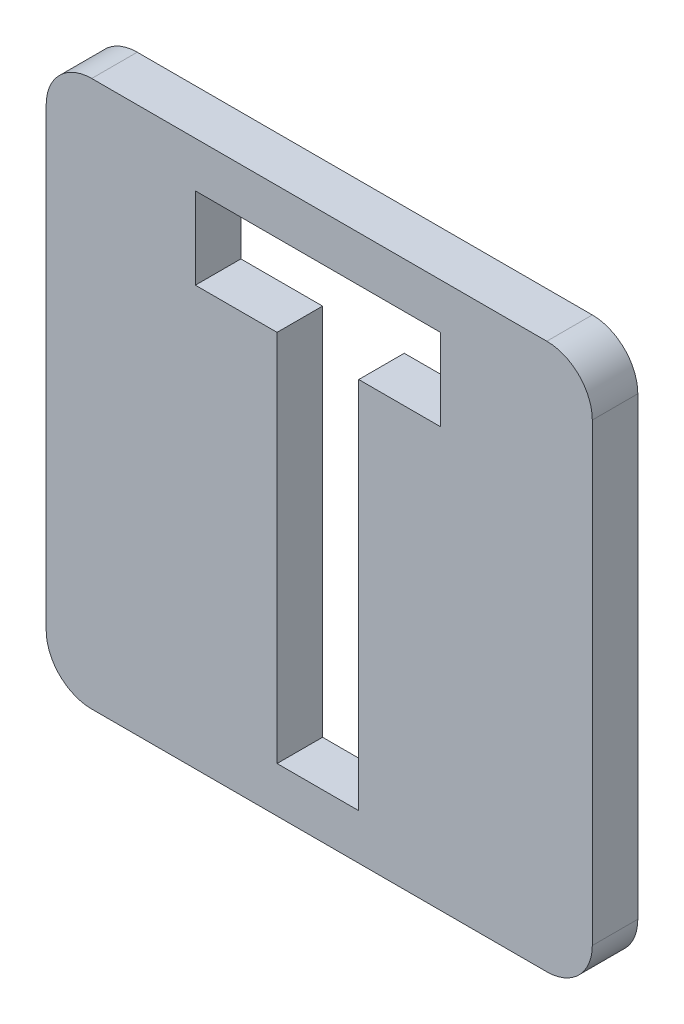
ISO-10303-21;
HEADER;
FILE_DESCRIPTION(('STEP AP214'),'2;1');
FILE_NAME('part.step','',(''),(''),'','','');
FILE_SCHEMA(('AUTOMOTIVE_DESIGN { 1 0 10303 214 1 1 1 1 }'));
ENDSEC;
DATA;
#1=APPLICATION_CONTEXT('core data for automotive mechanical design processes');
#2=APPLICATION_PROTOCOL_DEFINITION('international standard','automotive_design',2000,#1);
#3=PRODUCT_CONTEXT('',#1,'mechanical');
#4=PRODUCT('Part','Part','',(#3));
#5=PRODUCT_RELATED_PRODUCT_CATEGORY('part','',(#4));
#6=PRODUCT_DEFINITION_FORMATION('','',#4);
#7=PRODUCT_DEFINITION_CONTEXT('part definition',#1,'design');
#8=PRODUCT_DEFINITION('design','',#6,#7);
#9=PRODUCT_DEFINITION_SHAPE('','',#8);
#10=(LENGTH_UNIT() NAMED_UNIT(*) SI_UNIT(.MILLI.,.METRE.));
#11=(NAMED_UNIT(*) PLANE_ANGLE_UNIT() SI_UNIT($,.RADIAN.));
#12=(NAMED_UNIT(*) SI_UNIT($,.STERADIAN.) SOLID_ANGLE_UNIT());
#13=UNCERTAINTY_MEASURE_WITH_UNIT(LENGTH_MEASURE(1.E-05),#10,'distance_accuracy_value','');
#14=(GEOMETRIC_REPRESENTATION_CONTEXT(3) GLOBAL_UNCERTAINTY_ASSIGNED_CONTEXT((#13)) GLOBAL_UNIT_ASSIGNED_CONTEXT((#10,
#11,#12)) REPRESENTATION_CONTEXT('',''));
#15=CARTESIAN_POINT('',(0.,0.,0.));
#16=DIRECTION('',(0.,0.,1.));
#17=DIRECTION('',(1.,0.,0.));
#18=AXIS2_PLACEMENT_3D('',#15,#16,#17);
#19=CARTESIAN_POINT('',(50.,50.,10.));
#20=DIRECTION('',(0.,0.,-1.));
#21=DIRECTION('',(-1.,0.,0.));
#22=AXIS2_PLACEMENT_3D('',#19,#20,#21);
#23=PLANE('',#22);
#24=DIRECTION('',(1.,0.,0.));
#25=VECTOR('',#24,1.);
#26=CARTESIAN_POINT('',(-49.9999999999999,60.,10.));
#27=LINE('',#26,#25);
#28=CARTESIAN_POINT('',(-49.9999999999999,60.,10.));
#29=VERTEX_POINT('',#28);
#30=CARTESIAN_POINT('',(49.9999999999999,60.,10.));
#31=VERTEX_POINT('',#30);
#32=EDGE_CURVE('E213',#29,#31,#27,.T.);
#33=ORIENTED_EDGE('',*,*,#32,.F.);
#34=CARTESIAN_POINT('',(-50.,50.,10.));
#35=DIRECTION('',(0.,0.,1.));
#36=DIRECTION('',(1.,0.,0.));
#37=AXIS2_PLACEMENT_3D('',#34,#35,#36);
#38=CIRCLE('',#37,10.);
#39=CARTESIAN_POINT('',(-60.,49.9999999999999,10.));
#40=VERTEX_POINT('',#39);
#41=EDGE_CURVE('E231',#29,#40,#38,.T.);
#42=ORIENTED_EDGE('',*,*,#41,.T.);
#43=DIRECTION('',(0.,-1.,0.));
#44=VECTOR('',#43,1.);
#45=CARTESIAN_POINT('',(-60.,49.9999999999999,10.));
#46=LINE('',#45,#44);
#47=CARTESIAN_POINT('',(-60.,-49.9999999999999,10.));
#48=VERTEX_POINT('',#47);
#49=EDGE_CURVE('E229',#40,#48,#46,.T.);
#50=ORIENTED_EDGE('',*,*,#49,.T.);
#51=CARTESIAN_POINT('',(-50.,-50.,10.));
#52=DIRECTION('',(0.,0.,1.));
#53=DIRECTION('',(1.,0.,0.));
#54=AXIS2_PLACEMENT_3D('',#51,#52,#53);
#55=CIRCLE('',#54,10.);
#56=CARTESIAN_POINT('',(-49.9999999999999,-60.,10.));
#57=VERTEX_POINT('',#56);
#58=EDGE_CURVE('E227',#48,#57,#55,.T.);
#59=ORIENTED_EDGE('',*,*,#58,.T.);
#60=DIRECTION('',(1.,0.,0.));
#61=VECTOR('',#60,1.);
#62=CARTESIAN_POINT('',(-49.9999999999999,-60.,10.));
#63=LINE('',#62,#61);
#64=CARTESIAN_POINT('',(49.9999999999999,-60.,10.));
#65=VERTEX_POINT('',#64);
#66=EDGE_CURVE('E225',#57,#65,#63,.T.);
#67=ORIENTED_EDGE('',*,*,#66,.T.);
#68=CARTESIAN_POINT('',(50.,-50.,10.));
#69=DIRECTION('',(0.,0.,1.));
#70=DIRECTION('',(1.,0.,0.));
#71=AXIS2_PLACEMENT_3D('',#68,#69,#70);
#72=CIRCLE('',#71,10.);
#73=CARTESIAN_POINT('',(60.,-50.,10.));
#74=VERTEX_POINT('',#73);
#75=EDGE_CURVE('E223',#65,#74,#72,.T.);
#76=ORIENTED_EDGE('',*,*,#75,.T.);
#77=DIRECTION('',(0.,-1.,0.));
#78=VECTOR('',#77,1.);
#79=CARTESIAN_POINT('',(60.,49.9999999999999,10.));
#80=LINE('',#79,#78);
#81=CARTESIAN_POINT('',(60.,49.9999999999999,10.));
#82=VERTEX_POINT('',#81);
#83=EDGE_CURVE('E220',#82,#74,#80,.T.);
#84=ORIENTED_EDGE('',*,*,#83,.F.);
#85=CARTESIAN_POINT('',(50.,50.,10.));
#86=DIRECTION('',(0.,0.,-1.));
#87=DIRECTION('',(-1.,0.,0.));
#88=AXIS2_PLACEMENT_3D('',#85,#86,#87);
#89=CIRCLE('',#88,10.);
#90=EDGE_CURVE('E216',#31,#82,#89,.T.);
#91=ORIENTED_EDGE('',*,*,#90,.F.);
#92=EDGE_LOOP('',(#33,#42,#50,#59,#67,#76,#84,#91));
#93=FACE_BOUND('',#92,.T.);
#94=DIRECTION('',(0.,1.,0.));
#95=VECTOR('',#94,1.);
#96=CARTESIAN_POINT('',(-27.2179487179487,32.0512820512821,10.));
#97=LINE('',#96,#95);
#98=CARTESIAN_POINT('',(-27.2179487179487,32.0512820512821,10.));
#99=VERTEX_POINT('',#98);
#100=CARTESIAN_POINT('',(-27.2179487179487,50.,10.));
#101=VERTEX_POINT('',#100);
#102=EDGE_CURVE('E50',#99,#101,#97,.T.);
#103=ORIENTED_EDGE('',*,*,#102,.T.);
#104=DIRECTION('',(1.,0.,0.));
#105=VECTOR('',#104,1.);
#106=CARTESIAN_POINT('',(-27.2179487179487,50.,10.));
#107=LINE('',#106,#105);
#108=CARTESIAN_POINT('',(26.6282051282051,50.,10.));
#109=VERTEX_POINT('',#108);
#110=EDGE_CURVE('E162',#101,#109,#107,.T.);
#111=ORIENTED_EDGE('',*,*,#110,.T.);
#112=DIRECTION('',(0.,-1.,0.));
#113=VECTOR('',#112,1.);
#114=CARTESIAN_POINT('',(26.6282051282051,50.,10.));
#115=LINE('',#114,#113);
#116=CARTESIAN_POINT('',(26.6282051282051,32.0512820512821,10.));
#117=VERTEX_POINT('',#116);
#118=EDGE_CURVE('E185',#109,#117,#115,.T.);
#119=ORIENTED_EDGE('',*,*,#118,.T.);
#120=DIRECTION('',(-1.,0.,0.));
#121=VECTOR('',#120,1.);
#122=CARTESIAN_POINT('',(26.6282051282051,32.0512820512821,10.));
#123=LINE('',#122,#121);
#124=CARTESIAN_POINT('',(8.67948717948718,32.0512820512821,10.));
#125=VERTEX_POINT('',#124);
#126=EDGE_CURVE('E188',#117,#125,#123,.T.);
#127=ORIENTED_EDGE('',*,*,#126,.T.);
#128=DIRECTION('',(0.,-1.,0.));
#129=VECTOR('',#128,1.);
#130=CARTESIAN_POINT('',(8.67948717948718,32.0512820512821,10.));
#131=LINE('',#130,#129);
#132=CARTESIAN_POINT('',(8.67948717948718,-50.,10.));
#133=VERTEX_POINT('',#132);
#134=EDGE_CURVE('E191',#125,#133,#131,.T.);
#135=ORIENTED_EDGE('',*,*,#134,.T.);
#136=DIRECTION('',(-1.,0.,0.));
#137=VECTOR('',#136,1.);
#138=CARTESIAN_POINT('',(8.67948717948718,-50.,10.));
#139=LINE('',#138,#137);
#140=CARTESIAN_POINT('',(-9.26923076923077,-50.,10.));
#141=VERTEX_POINT('',#140);
#142=EDGE_CURVE('E194',#133,#141,#139,.T.);
#143=ORIENTED_EDGE('',*,*,#142,.T.);
#144=DIRECTION('',(0.,1.,0.));
#145=VECTOR('',#144,1.);
#146=CARTESIAN_POINT('',(-9.26923076923077,-50.,10.));
#147=LINE('',#146,#145);
#148=CARTESIAN_POINT('',(-9.26923076923077,32.0512820512821,10.));
#149=VERTEX_POINT('',#148);
#150=EDGE_CURVE('E197',#141,#149,#147,.T.);
#151=ORIENTED_EDGE('',*,*,#150,.T.);
#152=DIRECTION('',(-1.,0.,0.));
#153=VECTOR('',#152,1.);
#154=CARTESIAN_POINT('',(-9.26923076923077,32.0512820512821,10.));
#155=LINE('',#154,#153);
#156=EDGE_CURVE('E156',#149,#99,#155,.T.);
#157=ORIENTED_EDGE('',*,*,#156,.T.);
#158=EDGE_LOOP('',(#103,#111,#119,#127,#135,#143,#151,#157));
#159=FACE_BOUND('',#158,.T.);
#160=ADVANCED_FACE('F33',(#93,#159),#23,.F.);
#161=CARTESIAN_POINT('',(50.,50.,0.));
#162=DIRECTION('',(0.,0.,-1.));
#163=DIRECTION('',(-1.,0.,0.));
#164=AXIS2_PLACEMENT_3D('',#161,#162,#163);
#165=PLANE('',#164);
#166=DIRECTION('',(1.,0.,0.));
#167=VECTOR('',#166,1.);
#168=CARTESIAN_POINT('',(-49.9999999999999,60.,0.));
#169=LINE('',#168,#167);
#170=CARTESIAN_POINT('',(-49.9999999999999,60.,0.));
#171=VERTEX_POINT('',#170);
#172=CARTESIAN_POINT('',(49.9999999999999,60.,0.));
#173=VERTEX_POINT('',#172);
#174=EDGE_CURVE('E163',#171,#173,#169,.T.);
#175=ORIENTED_EDGE('',*,*,#174,.T.);
#176=CARTESIAN_POINT('',(50.,50.,0.));
#177=DIRECTION('',(0.,0.,-1.));
#178=DIRECTION('',(-1.,0.,0.));
#179=AXIS2_PLACEMENT_3D('',#176,#177,#178);
#180=CIRCLE('',#179,10.);
#181=CARTESIAN_POINT('',(60.,49.9999999999999,0.));
#182=VERTEX_POINT('',#181);
#183=EDGE_CURVE('E235',#173,#182,#180,.T.);
#184=ORIENTED_EDGE('',*,*,#183,.T.);
#185=DIRECTION('',(0.,-1.,0.));
#186=VECTOR('',#185,1.);
#187=CARTESIAN_POINT('',(60.,49.9999999999999,0.));
#188=LINE('',#187,#186);
#189=CARTESIAN_POINT('',(60.,-50.,0.));
#190=VERTEX_POINT('',#189);
#191=EDGE_CURVE('E238',#182,#190,#188,.T.);
#192=ORIENTED_EDGE('',*,*,#191,.T.);
#193=CARTESIAN_POINT('',(50.,-50.,0.));
#194=DIRECTION('',(0.,0.,1.));
#195=DIRECTION('',(1.,0.,0.));
#196=AXIS2_PLACEMENT_3D('',#193,#194,#195);
#197=CIRCLE('',#196,10.);
#198=CARTESIAN_POINT('',(49.9999999999999,-60.,0.));
#199=VERTEX_POINT('',#198);
#200=EDGE_CURVE('E241',#199,#190,#197,.T.);
#201=ORIENTED_EDGE('',*,*,#200,.F.);
#202=DIRECTION('',(1.,0.,0.));
#203=VECTOR('',#202,1.);
#204=CARTESIAN_POINT('',(-49.9999999999999,-60.,0.));
#205=LINE('',#204,#203);
#206=CARTESIAN_POINT('',(-49.9999999999999,-60.,0.));
#207=VERTEX_POINT('',#206);
#208=EDGE_CURVE('E244',#207,#199,#205,.T.);
#209=ORIENTED_EDGE('',*,*,#208,.F.);
#210=CARTESIAN_POINT('',(-50.,-50.,0.));
#211=DIRECTION('',(0.,0.,1.));
#212=DIRECTION('',(1.,0.,0.));
#213=AXIS2_PLACEMENT_3D('',#210,#211,#212);
#214=CIRCLE('',#213,10.);
#215=CARTESIAN_POINT('',(-60.,-49.9999999999999,0.));
#216=VERTEX_POINT('',#215);
#217=EDGE_CURVE('E246',#216,#207,#214,.T.);
#218=ORIENTED_EDGE('',*,*,#217,.F.);
#219=DIRECTION('',(0.,-1.,0.));
#220=VECTOR('',#219,1.);
#221=CARTESIAN_POINT('',(-60.,49.9999999999999,0.));
#222=LINE('',#221,#220);
#223=CARTESIAN_POINT('',(-60.,49.9999999999999,0.));
#224=VERTEX_POINT('',#223);
#225=EDGE_CURVE('E248',#224,#216,#222,.T.);
#226=ORIENTED_EDGE('',*,*,#225,.F.);
#227=CARTESIAN_POINT('',(-50.,50.,0.));
#228=DIRECTION('',(0.,0.,1.));
#229=DIRECTION('',(1.,0.,0.));
#230=AXIS2_PLACEMENT_3D('',#227,#228,#229);
#231=CIRCLE('',#230,10.);
#232=EDGE_CURVE('E217',#171,#224,#231,.T.);
#233=ORIENTED_EDGE('',*,*,#232,.F.);
#234=EDGE_LOOP('',(#175,#184,#192,#201,#209,#218,#226,#233));
#235=FACE_BOUND('',#234,.T.);
#236=DIRECTION('',(1.,0.,0.));
#237=VECTOR('',#236,1.);
#238=CARTESIAN_POINT('',(-27.2179487179487,50.,0.));
#239=LINE('',#238,#237);
#240=CARTESIAN_POINT('',(-27.2179487179487,50.,0.));
#241=VERTEX_POINT('',#240);
#242=CARTESIAN_POINT('',(26.6282051282051,50.,0.));
#243=VERTEX_POINT('',#242);
#244=EDGE_CURVE('E155',#241,#243,#239,.T.);
#245=ORIENTED_EDGE('',*,*,#244,.F.);
#246=DIRECTION('',(0.,1.,0.));
#247=VECTOR('',#246,1.);
#248=CARTESIAN_POINT('',(-27.2179487179487,32.0512820512821,0.));
#249=LINE('',#248,#247);
#250=CARTESIAN_POINT('',(-27.2179487179487,32.0512820512821,0.));
#251=VERTEX_POINT('',#250);
#252=EDGE_CURVE('E147',#251,#241,#249,.T.);
#253=ORIENTED_EDGE('',*,*,#252,.F.);
#254=DIRECTION('',(-1.,0.,0.));
#255=VECTOR('',#254,1.);
#256=CARTESIAN_POINT('',(-9.26923076923077,32.0512820512821,0.));
#257=LINE('',#256,#255);
#258=CARTESIAN_POINT('',(-9.26923076923077,32.0512820512821,0.));
#259=VERTEX_POINT('',#258);
#260=EDGE_CURVE('E181',#259,#251,#257,.T.);
#261=ORIENTED_EDGE('',*,*,#260,.F.);
#262=DIRECTION('',(0.,1.,0.));
#263=VECTOR('',#262,1.);
#264=CARTESIAN_POINT('',(-9.26923076923077,-50.,0.));
#265=LINE('',#264,#263);
#266=CARTESIAN_POINT('',(-9.26923076923077,-50.,0.));
#267=VERTEX_POINT('',#266);
#268=EDGE_CURVE('E179',#267,#259,#265,.T.);
#269=ORIENTED_EDGE('',*,*,#268,.F.);
#270=DIRECTION('',(-1.,0.,0.));
#271=VECTOR('',#270,1.);
#272=CARTESIAN_POINT('',(8.67948717948718,-50.,0.));
#273=LINE('',#272,#271);
#274=CARTESIAN_POINT('',(8.67948717948718,-50.,0.));
#275=VERTEX_POINT('',#274);
#276=EDGE_CURVE('E177',#275,#267,#273,.T.);
#277=ORIENTED_EDGE('',*,*,#276,.F.);
#278=DIRECTION('',(0.,-1.,0.));
#279=VECTOR('',#278,1.);
#280=CARTESIAN_POINT('',(8.67948717948718,32.0512820512821,0.));
#281=LINE('',#280,#279);
#282=CARTESIAN_POINT('',(8.67948717948718,32.0512820512821,0.));
#283=VERTEX_POINT('',#282);
#284=EDGE_CURVE('E175',#283,#275,#281,.T.);
#285=ORIENTED_EDGE('',*,*,#284,.F.);
#286=DIRECTION('',(-1.,0.,0.));
#287=VECTOR('',#286,1.);
#288=CARTESIAN_POINT('',(26.6282051282051,32.0512820512821,0.));
#289=LINE('',#288,#287);
#290=CARTESIAN_POINT('',(26.6282051282051,32.0512820512821,0.));
#291=VERTEX_POINT('',#290);
#292=EDGE_CURVE('E171',#291,#283,#289,.T.);
#293=ORIENTED_EDGE('',*,*,#292,.F.);
#294=DIRECTION('',(0.,-1.,0.));
#295=VECTOR('',#294,1.);
#296=CARTESIAN_POINT('',(26.6282051282051,50.,0.));
#297=LINE('',#296,#295);
#298=EDGE_CURVE('E169',#243,#291,#297,.T.);
#299=ORIENTED_EDGE('',*,*,#298,.F.);
#300=EDGE_LOOP('',(#245,#253,#261,#269,#277,#285,#293,#299));
#301=FACE_BOUND('',#300,.T.);
#302=ADVANCED_FACE('F167',(#235,#301),#165,.T.);
#303=CARTESIAN_POINT('',(-49.9999999999999,60.,10.));
#304=DIRECTION('',(0.,1.,0.));
#305=DIRECTION('',(0.,0.,1.));
#306=AXIS2_PLACEMENT_3D('',#303,#304,#305);
#307=PLANE('',#306);
#308=ORIENTED_EDGE('',*,*,#174,.F.);
#309=DIRECTION('',(0.,0.,-1.));
#310=VECTOR('',#309,1.);
#311=CARTESIAN_POINT('',(-49.9999999999999,60.,10.));
#312=LINE('',#311,#310);
#313=EDGE_CURVE('E11',#29,#171,#312,.T.);
#314=ORIENTED_EDGE('',*,*,#313,.F.);
#315=ORIENTED_EDGE('',*,*,#32,.T.);
#316=DIRECTION('',(0.,0.,-1.));
#317=VECTOR('',#316,1.);
#318=CARTESIAN_POINT('',(49.9999999999999,60.,10.));
#319=LINE('',#318,#317);
#320=EDGE_CURVE('E37',#31,#173,#319,.T.);
#321=ORIENTED_EDGE('',*,*,#320,.T.);
#322=EDGE_LOOP('',(#308,#314,#315,#321));
#323=FACE_BOUND('',#322,.T.);
#324=ADVANCED_FACE('F35',(#323),#307,.T.);
#325=CARTESIAN_POINT('',(-50.,50.,10.));
#326=DIRECTION('',(0.,0.,-1.));
#327=DIRECTION('',(-1.,0.,0.));
#328=AXIS2_PLACEMENT_3D('',#325,#326,#327);
#329=CYLINDRICAL_SURFACE('',#328,10.);
#330=ORIENTED_EDGE('',*,*,#232,.T.);
#331=DIRECTION('',(0.,0.,-1.));
#332=VECTOR('',#331,1.);
#333=CARTESIAN_POINT('',(-60.,49.9999999999999,10.));
#334=LINE('',#333,#332);
#335=EDGE_CURVE('E42',#40,#224,#334,.T.);
#336=ORIENTED_EDGE('',*,*,#335,.F.);
#337=ORIENTED_EDGE('',*,*,#41,.F.);
#338=ORIENTED_EDGE('',*,*,#313,.T.);
#339=EDGE_LOOP('',(#330,#336,#337,#338));
#340=FACE_BOUND('',#339,.T.);
#341=ADVANCED_FACE('F278',(#340),#329,.T.);
#342=CARTESIAN_POINT('',(-60.,49.9999999999999,10.));
#343=DIRECTION('',(1.,0.,0.));
#344=DIRECTION('',(0.,1.,0.));
#345=AXIS2_PLACEMENT_3D('',#342,#343,#344);
#346=PLANE('',#345);
#347=ORIENTED_EDGE('',*,*,#225,.T.);
#348=DIRECTION('',(0.,0.,-1.));
#349=VECTOR('',#348,1.);
#350=CARTESIAN_POINT('',(-60.,-49.9999999999999,10.));
#351=LINE('',#350,#349);
#352=EDGE_CURVE('E253',#48,#216,#351,.T.);
#353=ORIENTED_EDGE('',*,*,#352,.F.);
#354=ORIENTED_EDGE('',*,*,#49,.F.);
#355=ORIENTED_EDGE('',*,*,#335,.T.);
#356=EDGE_LOOP('',(#347,#353,#354,#355));
#357=FACE_BOUND('',#356,.T.);
#358=ADVANCED_FACE('F282',(#357),#346,.F.);
#359=CARTESIAN_POINT('',(-50.,-50.,10.));
#360=DIRECTION('',(0.,0.,-1.));
#361=DIRECTION('',(-1.,0.,0.));
#362=AXIS2_PLACEMENT_3D('',#359,#360,#361);
#363=CYLINDRICAL_SURFACE('',#362,10.);
#364=ORIENTED_EDGE('',*,*,#217,.T.);
#365=DIRECTION('',(0.,0.,-1.));
#366=VECTOR('',#365,1.);
#367=CARTESIAN_POINT('',(-49.9999999999999,-60.,10.));
#368=LINE('',#367,#366);
#369=EDGE_CURVE('E256',#57,#207,#368,.T.);
#370=ORIENTED_EDGE('',*,*,#369,.F.);
#371=ORIENTED_EDGE('',*,*,#58,.F.);
#372=ORIENTED_EDGE('',*,*,#352,.T.);
#373=EDGE_LOOP('',(#364,#370,#371,#372));
#374=FACE_BOUND('',#373,.T.);
#375=ADVANCED_FACE('F302',(#374),#363,.T.);
#376=CARTESIAN_POINT('',(-49.9999999999999,-60.,10.));
#377=DIRECTION('',(0.,1.,0.));
#378=DIRECTION('',(0.,0.,1.));
#379=AXIS2_PLACEMENT_3D('',#376,#377,#378);
#380=PLANE('',#379);
#381=ORIENTED_EDGE('',*,*,#208,.T.);
#382=DIRECTION('',(0.,0.,-1.));
#383=VECTOR('',#382,1.);
#384=CARTESIAN_POINT('',(49.9999999999999,-60.,10.));
#385=LINE('',#384,#383);
#386=EDGE_CURVE('E259',#65,#199,#385,.T.);
#387=ORIENTED_EDGE('',*,*,#386,.F.);
#388=ORIENTED_EDGE('',*,*,#66,.F.);
#389=ORIENTED_EDGE('',*,*,#369,.T.);
#390=EDGE_LOOP('',(#381,#387,#388,#389));
#391=FACE_BOUND('',#390,.T.);
#392=ADVANCED_FACE('F300',(#391),#380,.F.);
#393=CARTESIAN_POINT('',(50.,-50.,10.));
#394=DIRECTION('',(0.,0.,-1.));
#395=DIRECTION('',(-1.,0.,0.));
#396=AXIS2_PLACEMENT_3D('',#393,#394,#395);
#397=CYLINDRICAL_SURFACE('',#396,10.);
#398=ORIENTED_EDGE('',*,*,#200,.T.);
#399=DIRECTION('',(0.,0.,-1.));
#400=VECTOR('',#399,1.);
#401=CARTESIAN_POINT('',(60.,-50.,10.));
#402=LINE('',#401,#400);
#403=EDGE_CURVE('E262',#74,#190,#402,.T.);
#404=ORIENTED_EDGE('',*,*,#403,.F.);
#405=ORIENTED_EDGE('',*,*,#75,.F.);
#406=ORIENTED_EDGE('',*,*,#386,.T.);
#407=EDGE_LOOP('',(#398,#404,#405,#406));
#408=FACE_BOUND('',#407,.T.);
#409=ADVANCED_FACE('F296',(#408),#397,.T.);
#410=CARTESIAN_POINT('',(60.,49.9999999999999,10.));
#411=DIRECTION('',(1.,0.,0.));
#412=DIRECTION('',(0.,1.,0.));
#413=AXIS2_PLACEMENT_3D('',#410,#411,#412);
#414=PLANE('',#413);
#415=ORIENTED_EDGE('',*,*,#191,.F.);
#416=DIRECTION('',(0.,0.,-1.));
#417=VECTOR('',#416,1.);
#418=CARTESIAN_POINT('',(60.,49.9999999999999,10.));
#419=LINE('',#418,#417);
#420=EDGE_CURVE('E263',#82,#182,#419,.T.);
#421=ORIENTED_EDGE('',*,*,#420,.F.);
#422=ORIENTED_EDGE('',*,*,#83,.T.);
#423=ORIENTED_EDGE('',*,*,#403,.T.);
#424=EDGE_LOOP('',(#415,#421,#422,#423));
#425=FACE_BOUND('',#424,.T.);
#426=ADVANCED_FACE('F292',(#425),#414,.T.);
#427=CARTESIAN_POINT('',(50.,50.,10.));
#428=DIRECTION('',(0.,0.,-1.));
#429=DIRECTION('',(-1.,0.,0.));
#430=AXIS2_PLACEMENT_3D('',#427,#428,#429);
#431=CYLINDRICAL_SURFACE('',#430,10.);
#432=ORIENTED_EDGE('',*,*,#183,.F.);
#433=ORIENTED_EDGE('',*,*,#320,.F.);
#434=ORIENTED_EDGE('',*,*,#90,.T.);
#435=ORIENTED_EDGE('',*,*,#420,.T.);
#436=EDGE_LOOP('',(#432,#433,#434,#435));
#437=FACE_BOUND('',#436,.T.);
#438=ADVANCED_FACE('F271',(#437),#431,.T.);
#439=CARTESIAN_POINT('',(-27.2179487179487,32.0512820512821,0.));
#440=DIRECTION('',(1.,0.,0.));
#441=DIRECTION('',(0.,0.,-1.));
#442=AXIS2_PLACEMENT_3D('',#439,#440,#441);
#443=PLANE('',#442);
#444=ORIENTED_EDGE('',*,*,#102,.F.);
#445=DIRECTION('',(0.,0.,1.));
#446=VECTOR('',#445,1.);
#447=CARTESIAN_POINT('',(-27.2179487179487,32.0512820512821,0.));
#448=LINE('',#447,#446);
#449=EDGE_CURVE('E151',#251,#99,#448,.T.);
#450=ORIENTED_EDGE('',*,*,#449,.F.);
#451=ORIENTED_EDGE('',*,*,#252,.T.);
#452=DIRECTION('',(0.,0.,1.));
#453=VECTOR('',#452,1.);
#454=CARTESIAN_POINT('',(-27.2179487179487,50.,0.));
#455=LINE('',#454,#453);
#456=EDGE_CURVE('E150',#241,#101,#455,.T.);
#457=ORIENTED_EDGE('',*,*,#456,.T.);
#458=EDGE_LOOP('',(#444,#450,#451,#457));
#459=FACE_BOUND('',#458,.T.);
#460=ADVANCED_FACE('F149',(#459),#443,.T.);
#461=CARTESIAN_POINT('',(-27.2179487179487,50.,0.));
#462=DIRECTION('',(0.,-1.,0.));
#463=DIRECTION('',(0.,0.,-1.));
#464=AXIS2_PLACEMENT_3D('',#461,#462,#463);
#465=PLANE('',#464);
#466=ORIENTED_EDGE('',*,*,#110,.F.);
#467=ORIENTED_EDGE('',*,*,#456,.F.);
#468=ORIENTED_EDGE('',*,*,#244,.T.);
#469=DIRECTION('',(0.,0.,1.));
#470=VECTOR('',#469,1.);
#471=CARTESIAN_POINT('',(26.6282051282051,50.,0.));
#472=LINE('',#471,#470);
#473=EDGE_CURVE('E164',#243,#109,#472,.T.);
#474=ORIENTED_EDGE('',*,*,#473,.T.);
#475=EDGE_LOOP('',(#466,#467,#468,#474));
#476=FACE_BOUND('',#475,.T.);
#477=ADVANCED_FACE('F159',(#476),#465,.T.);
#478=CARTESIAN_POINT('',(26.6282051282051,50.,0.));
#479=DIRECTION('',(-1.,0.,0.));
#480=DIRECTION('',(0.,0.,1.));
#481=AXIS2_PLACEMENT_3D('',#478,#479,#480);
#482=PLANE('',#481);
#483=ORIENTED_EDGE('',*,*,#118,.F.);
#484=ORIENTED_EDGE('',*,*,#473,.F.);
#485=ORIENTED_EDGE('',*,*,#298,.T.);
#486=DIRECTION('',(0.,0.,1.));
#487=VECTOR('',#486,1.);
#488=CARTESIAN_POINT('',(26.6282051282051,32.0512820512821,0.));
#489=LINE('',#488,#487);
#490=EDGE_CURVE('E210',#291,#117,#489,.T.);
#491=ORIENTED_EDGE('',*,*,#490,.T.);
#492=EDGE_LOOP('',(#483,#484,#485,#491));
#493=FACE_BOUND('',#492,.T.);
#494=ADVANCED_FACE('F351',(#493),#482,.T.);
#495=CARTESIAN_POINT('',(26.6282051282051,32.0512820512821,0.));
#496=DIRECTION('',(0.,1.,0.));
#497=DIRECTION('',(0.,0.,1.));
#498=AXIS2_PLACEMENT_3D('',#495,#496,#497);
#499=PLANE('',#498);
#500=ORIENTED_EDGE('',*,*,#126,.F.);
#501=ORIENTED_EDGE('',*,*,#490,.F.);
#502=ORIENTED_EDGE('',*,*,#292,.T.);
#503=DIRECTION('',(0.,0.,1.));
#504=VECTOR('',#503,1.);
#505=CARTESIAN_POINT('',(8.67948717948718,32.0512820512821,0.));
#506=LINE('',#505,#504);
#507=EDGE_CURVE('E208',#283,#125,#506,.T.);
#508=ORIENTED_EDGE('',*,*,#507,.T.);
#509=EDGE_LOOP('',(#500,#501,#502,#508));
#510=FACE_BOUND('',#509,.T.);
#511=ADVANCED_FACE('F359',(#510),#499,.T.);
#512=CARTESIAN_POINT('',(8.67948717948718,32.0512820512821,0.));
#513=DIRECTION('',(-1.,0.,0.));
#514=DIRECTION('',(0.,0.,1.));
#515=AXIS2_PLACEMENT_3D('',#512,#513,#514);
#516=PLANE('',#515);
#517=ORIENTED_EDGE('',*,*,#134,.F.);
#518=ORIENTED_EDGE('',*,*,#507,.F.);
#519=ORIENTED_EDGE('',*,*,#284,.T.);
#520=DIRECTION('',(0.,0.,1.));
#521=VECTOR('',#520,1.);
#522=CARTESIAN_POINT('',(8.67948717948718,-50.,0.));
#523=LINE('',#522,#521);
#524=EDGE_CURVE('E206',#275,#133,#523,.T.);
#525=ORIENTED_EDGE('',*,*,#524,.T.);
#526=EDGE_LOOP('',(#517,#518,#519,#525));
#527=FACE_BOUND('',#526,.T.);
#528=ADVANCED_FACE('F369',(#527),#516,.T.);
#529=CARTESIAN_POINT('',(8.67948717948718,-50.,0.));
#530=DIRECTION('',(0.,1.,0.));
#531=DIRECTION('',(0.,0.,1.));
#532=AXIS2_PLACEMENT_3D('',#529,#530,#531);
#533=PLANE('',#532);
#534=ORIENTED_EDGE('',*,*,#142,.F.);
#535=ORIENTED_EDGE('',*,*,#524,.F.);
#536=ORIENTED_EDGE('',*,*,#276,.T.);
#537=DIRECTION('',(0.,0.,1.));
#538=VECTOR('',#537,1.);
#539=CARTESIAN_POINT('',(-9.26923076923077,-50.,0.));
#540=LINE('',#539,#538);
#541=EDGE_CURVE('E204',#267,#141,#540,.T.);
#542=ORIENTED_EDGE('',*,*,#541,.T.);
#543=EDGE_LOOP('',(#534,#535,#536,#542));
#544=FACE_BOUND('',#543,.T.);
#545=ADVANCED_FACE('F379',(#544),#533,.T.);
#546=CARTESIAN_POINT('',(-9.26923076923077,-50.,0.));
#547=DIRECTION('',(1.,0.,0.));
#548=DIRECTION('',(0.,0.,-1.));
#549=AXIS2_PLACEMENT_3D('',#546,#547,#548);
#550=PLANE('',#549);
#551=ORIENTED_EDGE('',*,*,#150,.F.);
#552=ORIENTED_EDGE('',*,*,#541,.F.);
#553=ORIENTED_EDGE('',*,*,#268,.T.);
#554=DIRECTION('',(0.,0.,1.));
#555=VECTOR('',#554,1.);
#556=CARTESIAN_POINT('',(-9.26923076923077,32.0512820512821,0.));
#557=LINE('',#556,#555);
#558=EDGE_CURVE('E58',#259,#149,#557,.T.);
#559=ORIENTED_EDGE('',*,*,#558,.T.);
#560=EDGE_LOOP('',(#551,#552,#553,#559));
#561=FACE_BOUND('',#560,.T.);
#562=ADVANCED_FACE('F389',(#561),#550,.T.);
#563=CARTESIAN_POINT('',(-9.26923076923077,32.0512820512821,0.));
#564=DIRECTION('',(0.,1.,0.));
#565=DIRECTION('',(0.,0.,1.));
#566=AXIS2_PLACEMENT_3D('',#563,#564,#565);
#567=PLANE('',#566);
#568=ORIENTED_EDGE('',*,*,#156,.F.);
#569=ORIENTED_EDGE('',*,*,#558,.F.);
#570=ORIENTED_EDGE('',*,*,#260,.T.);
#571=ORIENTED_EDGE('',*,*,#449,.T.);
#572=EDGE_LOOP('',(#568,#569,#570,#571));
#573=FACE_BOUND('',#572,.T.);
#574=ADVANCED_FACE('F399',(#573),#567,.T.);
#575=CLOSED_SHELL('',(#160,#302,#324,#341,#358,#375,#392,#409,#426,#438,#460,#477,#494,#511,
#528,#545,#562,#574));
#576=MANIFOLD_SOLID_BREP('B2',#575);
#577=ADVANCED_BREP_SHAPE_REPRESENTATION('',(#18,#576),#14);
#578=SHAPE_DEFINITION_REPRESENTATION(#9,#577);
ENDSEC;
END-ISO-10303-21;
